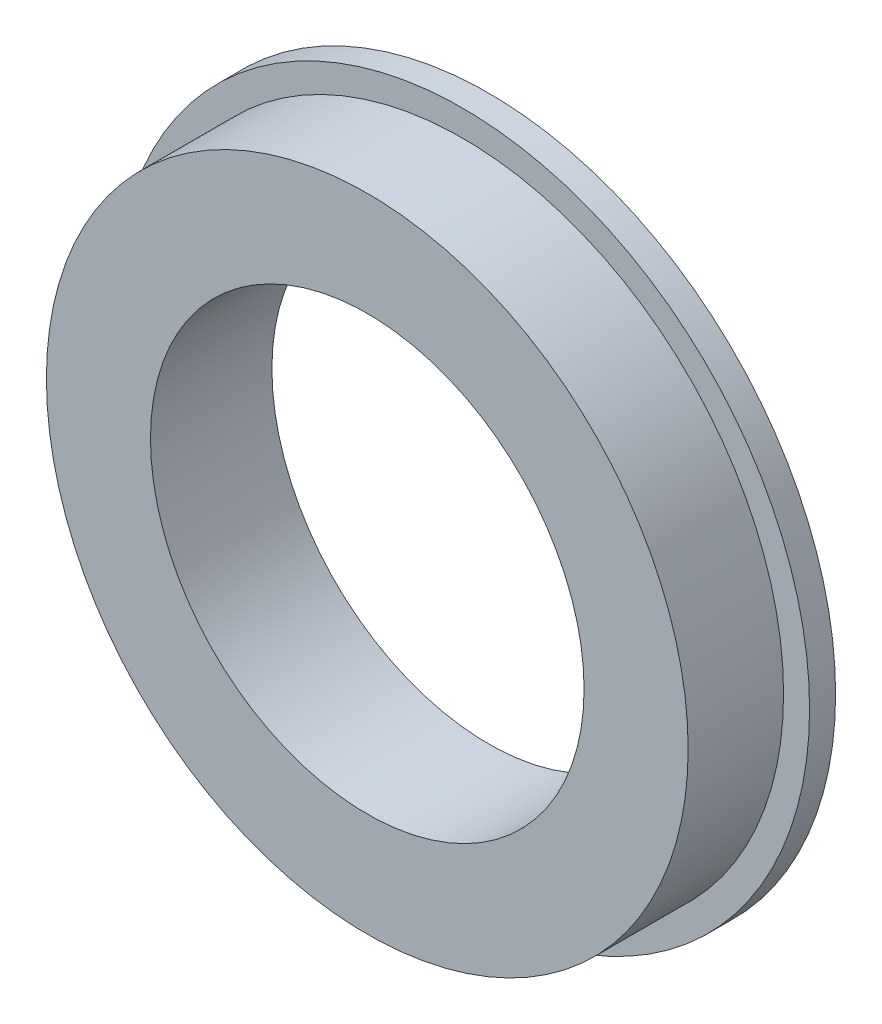
ISO-10303-21;
HEADER;
FILE_DESCRIPTION(('STEP AP214'),'2;1');
FILE_NAME('part.step','',(''),(''),'','','');
FILE_SCHEMA(('AUTOMOTIVE_DESIGN { 1 0 10303 214 1 1 1 1 }'));
ENDSEC;
DATA;
#1=APPLICATION_CONTEXT('core data for automotive mechanical design processes');
#2=APPLICATION_PROTOCOL_DEFINITION('international standard','automotive_design',2000,#1);
#3=PRODUCT_CONTEXT('',#1,'mechanical');
#4=PRODUCT('Part','Part','',(#3));
#5=PRODUCT_RELATED_PRODUCT_CATEGORY('part','',(#4));
#6=PRODUCT_DEFINITION_FORMATION('','',#4);
#7=PRODUCT_DEFINITION_CONTEXT('part definition',#1,'design');
#8=PRODUCT_DEFINITION('design','',#6,#7);
#9=PRODUCT_DEFINITION_SHAPE('','',#8);
#10=(LENGTH_UNIT() NAMED_UNIT(*) SI_UNIT(.MILLI.,.METRE.));
#11=(NAMED_UNIT(*) PLANE_ANGLE_UNIT() SI_UNIT($,.RADIAN.));
#12=(NAMED_UNIT(*) SI_UNIT($,.STERADIAN.) SOLID_ANGLE_UNIT());
#13=UNCERTAINTY_MEASURE_WITH_UNIT(LENGTH_MEASURE(1.E-05),#10,'distance_accuracy_value','');
#14=(GEOMETRIC_REPRESENTATION_CONTEXT(3) GLOBAL_UNCERTAINTY_ASSIGNED_CONTEXT((#13)) GLOBAL_UNIT_ASSIGNED_CONTEXT((#10,
#11,#12)) REPRESENTATION_CONTEXT('',''));
#15=CARTESIAN_POINT('',(0.,0.,0.));
#16=DIRECTION('',(0.,0.,1.));
#17=DIRECTION('',(1.,0.,0.));
#18=AXIS2_PLACEMENT_3D('',#15,#16,#17);
#19=CARTESIAN_POINT('',(0.,0.,5.5));
#20=DIRECTION('',(0.,0.,1.));
#21=DIRECTION('',(1.,0.,0.));
#22=AXIS2_PLACEMENT_3D('',#19,#20,#21);
#23=PLANE('',#22);
#24=CARTESIAN_POINT('',(0.,0.,5.5));
#25=DIRECTION('',(0.,0.,1.));
#26=DIRECTION('',(1.,0.,0.));
#27=AXIS2_PLACEMENT_3D('',#24,#25,#26);
#28=CIRCLE('',#27,18.5);
#29=CARTESIAN_POINT('',(18.5,0.,5.5));
#30=VERTEX_POINT('',#29);
#31=EDGE_CURVE('E10',#30,#30,#28,.T.);
#32=ORIENTED_EDGE('',*,*,#31,.T.);
#33=EDGE_LOOP('',(#32));
#34=FACE_BOUND('',#33,.T.);
#35=CARTESIAN_POINT('',(0.,0.,5.5));
#36=DIRECTION('',(0.,0.,1.));
#37=DIRECTION('',(1.,0.,0.));
#38=AXIS2_PLACEMENT_3D('',#35,#36,#37);
#39=CIRCLE('',#38,12.5);
#40=CARTESIAN_POINT('',(12.5,0.,5.5));
#41=VERTEX_POINT('',#40);
#42=EDGE_CURVE('E40',#41,#41,#39,.T.);
#43=ORIENTED_EDGE('',*,*,#42,.F.);
#44=EDGE_LOOP('',(#43));
#45=FACE_BOUND('',#44,.T.);
#46=ADVANCED_FACE('F32',(#34,#45),#23,.T.);
#47=CARTESIAN_POINT('',(0.,0.,5.5));
#48=DIRECTION('',(0.,0.,-1.));
#49=DIRECTION('',(-1.,0.,0.));
#50=AXIS2_PLACEMENT_3D('',#47,#48,#49);
#51=CYLINDRICAL_SURFACE('',#50,18.5);
#52=ORIENTED_EDGE('',*,*,#31,.F.);
#53=EDGE_LOOP('',(#52));
#54=FACE_BOUND('',#53,.T.);
#55=CARTESIAN_POINT('',(0.,0.,0.));
#56=DIRECTION('',(0.,0.,1.));
#57=DIRECTION('',(1.,0.,0.));
#58=AXIS2_PLACEMENT_3D('',#55,#56,#57);
#59=CIRCLE('',#58,18.5);
#60=CARTESIAN_POINT('',(18.5,0.,0.));
#61=VERTEX_POINT('',#60);
#62=EDGE_CURVE('E36',#61,#61,#59,.T.);
#63=ORIENTED_EDGE('',*,*,#62,.T.);
#64=EDGE_LOOP('',(#63));
#65=FACE_BOUND('',#64,.T.);
#66=ADVANCED_FACE('F34',(#54,#65),#51,.T.);
#67=CARTESIAN_POINT('',(0.,0.,5.5));
#68=DIRECTION('',(0.,0.,-1.));
#69=DIRECTION('',(-1.,0.,0.));
#70=AXIS2_PLACEMENT_3D('',#67,#68,#69);
#71=CYLINDRICAL_SURFACE('',#70,12.5);
#72=ORIENTED_EDGE('',*,*,#42,.T.);
#73=EDGE_LOOP('',(#72));
#74=FACE_BOUND('',#73,.T.);
#75=CARTESIAN_POINT('',(0.,0.,-1.5));
#76=DIRECTION('',(0.,0.,-1.));
#77=DIRECTION('',(-1.,0.,0.));
#78=AXIS2_PLACEMENT_3D('',#75,#76,#77);
#79=CIRCLE('',#78,12.5);
#80=CARTESIAN_POINT('',(-12.5,0.,-1.5));
#81=VERTEX_POINT('',#80);
#82=EDGE_CURVE('E50',#81,#81,#79,.T.);
#83=ORIENTED_EDGE('',*,*,#82,.T.);
#84=EDGE_LOOP('',(#83));
#85=FACE_BOUND('',#84,.T.);
#86=ADVANCED_FACE('F56',(#74,#85),#71,.F.);
#87=CARTESIAN_POINT('',(0.,0.,-1.5));
#88=DIRECTION('',(0.,0.,-1.));
#89=DIRECTION('',(-1.,0.,0.));
#90=AXIS2_PLACEMENT_3D('',#87,#88,#89);
#91=PLANE('',#90);
#92=CARTESIAN_POINT('',(0.,0.,-1.5));
#93=DIRECTION('',(0.,0.,-1.));
#94=DIRECTION('',(-1.,0.,0.));
#95=AXIS2_PLACEMENT_3D('',#92,#93,#94);
#96=CIRCLE('',#95,20.);
#97=CARTESIAN_POINT('',(-20.,0.,-1.5));
#98=VERTEX_POINT('',#97);
#99=EDGE_CURVE('E49',#98,#98,#96,.T.);
#100=ORIENTED_EDGE('',*,*,#99,.T.);
#101=EDGE_LOOP('',(#100));
#102=FACE_BOUND('',#101,.T.);
#103=ORIENTED_EDGE('',*,*,#82,.F.);
#104=EDGE_LOOP('',(#103));
#105=FACE_BOUND('',#104,.T.);
#106=ADVANCED_FACE('F58',(#102,#105),#91,.T.);
#107=CARTESIAN_POINT('',(0.,0.,0.));
#108=DIRECTION('',(0.,0.,-1.));
#109=DIRECTION('',(-1.,0.,0.));
#110=AXIS2_PLACEMENT_3D('',#107,#108,#109);
#111=PLANE('',#110);
#112=ORIENTED_EDGE('',*,*,#62,.F.);
#113=EDGE_LOOP('',(#112));
#114=FACE_BOUND('',#113,.T.);
#115=CARTESIAN_POINT('',(0.,0.,0.));
#116=DIRECTION('',(0.,0.,-1.));
#117=DIRECTION('',(-1.,0.,0.));
#118=AXIS2_PLACEMENT_3D('',#115,#116,#117);
#119=CIRCLE('',#118,20.);
#120=CARTESIAN_POINT('',(-20.,0.,0.));
#121=VERTEX_POINT('',#120);
#122=EDGE_CURVE('E46',#121,#121,#119,.T.);
#123=ORIENTED_EDGE('',*,*,#122,.F.);
#124=EDGE_LOOP('',(#123));
#125=FACE_BOUND('',#124,.T.);
#126=ADVANCED_FACE('F60',(#114,#125),#111,.F.);
#127=CARTESIAN_POINT('',(0.,0.,-1.5));
#128=DIRECTION('',(0.,0.,1.));
#129=DIRECTION('',(1.,0.,0.));
#130=AXIS2_PLACEMENT_3D('',#127,#128,#129);
#131=CYLINDRICAL_SURFACE('',#130,20.);
#132=ORIENTED_EDGE('',*,*,#99,.F.);
#133=EDGE_LOOP('',(#132));
#134=FACE_BOUND('',#133,.T.);
#135=ORIENTED_EDGE('',*,*,#122,.T.);
#136=EDGE_LOOP('',(#135));
#137=FACE_BOUND('',#136,.T.);
#138=ADVANCED_FACE('F67',(#134,#137),#131,.T.);
#139=CLOSED_SHELL('',(#46,#66,#86,#106,#126,#138));
#140=MANIFOLD_SOLID_BREP('B2',#139);
#141=ADVANCED_BREP_SHAPE_REPRESENTATION('',(#18,#140),#14);
#142=SHAPE_DEFINITION_REPRESENTATION(#9,#141);
ENDSEC;
END-ISO-10303-21;
